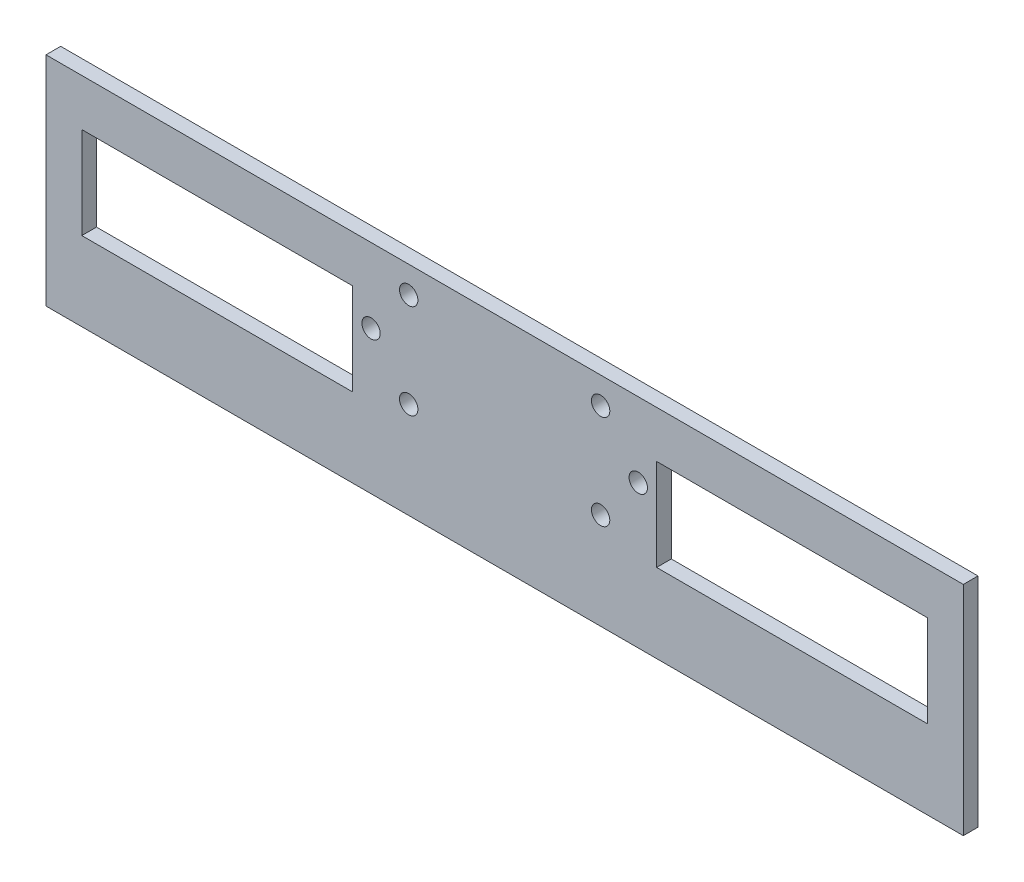
ISO-10303-21;
HEADER;
FILE_DESCRIPTION(('STEP AP214'),'2;1');
FILE_NAME('part.step','',(''),(''),'','','');
FILE_SCHEMA(('AUTOMOTIVE_DESIGN { 1 0 10303 214 1 1 1 1 }'));
ENDSEC;
DATA;
#1=APPLICATION_CONTEXT('core data for automotive mechanical design processes');
#2=APPLICATION_PROTOCOL_DEFINITION('international standard','automotive_design',2000,#1);
#3=PRODUCT_CONTEXT('',#1,'mechanical');
#4=PRODUCT('Part','Part','',(#3));
#5=PRODUCT_RELATED_PRODUCT_CATEGORY('part','',(#4));
#6=PRODUCT_DEFINITION_FORMATION('','',#4);
#7=PRODUCT_DEFINITION_CONTEXT('part definition',#1,'design');
#8=PRODUCT_DEFINITION('design','',#6,#7);
#9=PRODUCT_DEFINITION_SHAPE('','',#8);
#10=(LENGTH_UNIT() NAMED_UNIT(*) SI_UNIT(.MILLI.,.METRE.));
#11=(NAMED_UNIT(*) PLANE_ANGLE_UNIT() SI_UNIT($,.RADIAN.));
#12=(NAMED_UNIT(*) SI_UNIT($,.STERADIAN.) SOLID_ANGLE_UNIT());
#13=UNCERTAINTY_MEASURE_WITH_UNIT(LENGTH_MEASURE(1.E-05),#10,'distance_accuracy_value','');
#14=(GEOMETRIC_REPRESENTATION_CONTEXT(3) GLOBAL_UNCERTAINTY_ASSIGNED_CONTEXT((#13)) GLOBAL_UNIT_ASSIGNED_CONTEXT((#10,
#11,#12)) REPRESENTATION_CONTEXT('',''));
#15=CARTESIAN_POINT('',(0.,0.,0.));
#16=DIRECTION('',(0.,0.,1.));
#17=DIRECTION('',(1.,0.,0.));
#18=AXIS2_PLACEMENT_3D('',#15,#16,#17);
#19=CARTESIAN_POINT('',(0.,0.,1.6));
#20=DIRECTION('',(0.,0.,1.));
#21=DIRECTION('',(1.,0.,0.));
#22=AXIS2_PLACEMENT_3D('',#19,#20,#21);
#23=PLANE('',#22);
#24=CARTESIAN_POINT('',(64.5,-8.09999999999999,1.6));
#25=DIRECTION('',(0.,0.,1.));
#26=DIRECTION('',(-1.,0.,0.));
#27=AXIS2_PLACEMENT_3D('',#24,#25,#26);
#28=CIRCLE('',#27,0.999999999999998);
#29=CARTESIAN_POINT('',(63.5,-8.09999999999999,1.6));
#30=VERTEX_POINT('',#29);
#31=EDGE_CURVE('E315',#30,#30,#28,.T.);
#32=ORIENTED_EDGE('',*,*,#31,.F.);
#33=EDGE_LOOP('',(#32));
#34=FACE_BOUND('',#33,.T.);
#35=DIRECTION('',(-1.,0.,0.));
#36=VECTOR('',#35,1.);
#37=CARTESIAN_POINT('',(96.,-5.09999999999998,1.6));
#38=LINE('',#37,#36);
#39=CARTESIAN_POINT('',(96.,-5.09999999999998,1.6));
#40=VERTEX_POINT('',#39);
#41=CARTESIAN_POINT('',(66.5,-5.09999999999999,1.6));
#42=VERTEX_POINT('',#41);
#43=EDGE_CURVE('E133',#40,#42,#38,.T.);
#44=ORIENTED_EDGE('',*,*,#43,.F.);
#45=DIRECTION('',(0.,1.,0.));
#46=VECTOR('',#45,1.);
#47=CARTESIAN_POINT('',(96.,-5.09999999999998,1.6));
#48=LINE('',#47,#46);
#49=CARTESIAN_POINT('',(96.,-15.1,1.6));
#50=VERTEX_POINT('',#49);
#51=EDGE_CURVE('E125',#50,#40,#48,.T.);
#52=ORIENTED_EDGE('',*,*,#51,.F.);
#53=DIRECTION('',(1.,0.,0.));
#54=VECTOR('',#53,1.);
#55=CARTESIAN_POINT('',(96.,-15.1,1.6));
#56=LINE('',#55,#54);
#57=CARTESIAN_POINT('',(66.5,-15.1,1.6));
#58=VERTEX_POINT('',#57);
#59=EDGE_CURVE('E148',#58,#50,#56,.T.);
#60=ORIENTED_EDGE('',*,*,#59,.F.);
#61=DIRECTION('',(0.,-1.,0.));
#62=VECTOR('',#61,1.);
#63=CARTESIAN_POINT('',(66.5,-5.09999999999999,1.6));
#64=LINE('',#63,#62);
#65=EDGE_CURVE('E146',#42,#58,#64,.T.);
#66=ORIENTED_EDGE('',*,*,#65,.F.);
#67=EDGE_LOOP('',(#44,#52,#60,#66));
#68=FACE_BOUND('',#67,.T.);
#69=CARTESIAN_POINT('',(39.5,-13.2,1.6));
#70=DIRECTION('',(0.,0.,1.));
#71=DIRECTION('',(1.,0.,0.));
#72=AXIS2_PLACEMENT_3D('',#69,#70,#71);
#73=CIRCLE('',#72,0.999999999999998);
#74=CARTESIAN_POINT('',(40.5,-13.2,1.6));
#75=VERTEX_POINT('',#74);
#76=EDGE_CURVE('E164',#75,#75,#73,.T.);
#77=ORIENTED_EDGE('',*,*,#76,.F.);
#78=EDGE_LOOP('',(#77));
#79=FACE_BOUND('',#78,.T.);
#80=CARTESIAN_POINT('',(39.5,-2.9,1.6));
#81=DIRECTION('',(0.,0.,1.));
#82=DIRECTION('',(1.,0.,0.));
#83=AXIS2_PLACEMENT_3D('',#80,#81,#82);
#84=CIRCLE('',#83,0.999999999999998);
#85=CARTESIAN_POINT('',(40.5,-2.9,1.6));
#86=VERTEX_POINT('',#85);
#87=EDGE_CURVE('E176',#86,#86,#84,.T.);
#88=ORIENTED_EDGE('',*,*,#87,.F.);
#89=EDGE_LOOP('',(#88));
#90=FACE_BOUND('',#89,.T.);
#91=DIRECTION('',(0.,-1.,0.));
#92=VECTOR('',#91,1.);
#93=CARTESIAN_POINT('',(0.,0.,1.6));
#94=LINE('',#93,#92);
#95=CARTESIAN_POINT('',(0.,0.,1.6));
#96=VERTEX_POINT('',#95);
#97=CARTESIAN_POINT('',(0.,-23.7,1.6));
#98=VERTEX_POINT('',#97);
#99=EDGE_CURVE('E213',#96,#98,#94,.T.);
#100=ORIENTED_EDGE('',*,*,#99,.T.);
#101=DIRECTION('',(1.,0.,0.));
#102=VECTOR('',#101,1.);
#103=CARTESIAN_POINT('',(0.,-23.7,1.6));
#104=LINE('',#103,#102);
#105=CARTESIAN_POINT('',(99.9,-23.7,1.6));
#106=VERTEX_POINT('',#105);
#107=EDGE_CURVE('E216',#98,#106,#104,.T.);
#108=ORIENTED_EDGE('',*,*,#107,.T.);
#109=DIRECTION('',(0.,1.,0.));
#110=VECTOR('',#109,1.);
#111=CARTESIAN_POINT('',(99.9,0.,1.6));
#112=LINE('',#111,#110);
#113=CARTESIAN_POINT('',(99.9,0.,1.6));
#114=VERTEX_POINT('',#113);
#115=EDGE_CURVE('E219',#106,#114,#112,.T.);
#116=ORIENTED_EDGE('',*,*,#115,.T.);
#117=DIRECTION('',(-1.,0.,0.));
#118=VECTOR('',#117,1.);
#119=CARTESIAN_POINT('',(0.,0.,1.6));
#120=LINE('',#119,#118);
#121=EDGE_CURVE('E221',#114,#96,#120,.T.);
#122=ORIENTED_EDGE('',*,*,#121,.T.);
#123=EDGE_LOOP('',(#100,#108,#116,#122));
#124=FACE_BOUND('',#123,.T.);
#125=DIRECTION('',(1.,0.,0.));
#126=VECTOR('',#125,1.);
#127=CARTESIAN_POINT('',(3.9,-15.1,1.6));
#128=LINE('',#127,#126);
#129=CARTESIAN_POINT('',(3.9,-15.1,1.6));
#130=VERTEX_POINT('',#129);
#131=CARTESIAN_POINT('',(33.4,-15.1,1.6));
#132=VERTEX_POINT('',#131);
#133=EDGE_CURVE('E184',#130,#132,#128,.T.);
#134=ORIENTED_EDGE('',*,*,#133,.F.);
#135=DIRECTION('',(0.,-1.,0.));
#136=VECTOR('',#135,1.);
#137=CARTESIAN_POINT('',(3.9,-5.1,1.6));
#138=LINE('',#137,#136);
#139=CARTESIAN_POINT('',(3.9,-5.1,1.6));
#140=VERTEX_POINT('',#139);
#141=EDGE_CURVE('E182',#140,#130,#138,.T.);
#142=ORIENTED_EDGE('',*,*,#141,.F.);
#143=DIRECTION('',(-1.,0.,0.));
#144=VECTOR('',#143,1.);
#145=CARTESIAN_POINT('',(3.9,-5.1,1.6));
#146=LINE('',#145,#144);
#147=CARTESIAN_POINT('',(33.4,-5.1,1.6));
#148=VERTEX_POINT('',#147);
#149=EDGE_CURVE('E190',#148,#140,#146,.T.);
#150=ORIENTED_EDGE('',*,*,#149,.F.);
#151=DIRECTION('',(0.,1.,0.));
#152=VECTOR('',#151,1.);
#153=CARTESIAN_POINT('',(33.4,-5.1,1.6));
#154=LINE('',#153,#152);
#155=EDGE_CURVE('E187',#132,#148,#154,.T.);
#156=ORIENTED_EDGE('',*,*,#155,.F.);
#157=EDGE_LOOP('',(#134,#142,#150,#156));
#158=FACE_BOUND('',#157,.T.);
#159=CARTESIAN_POINT('',(35.4,-8.1,1.6));
#160=DIRECTION('',(0.,0.,1.));
#161=DIRECTION('',(1.,0.,0.));
#162=AXIS2_PLACEMENT_3D('',#159,#160,#161);
#163=CIRCLE('',#162,0.999999999999998);
#164=CARTESIAN_POINT('',(36.4,-8.1,1.6));
#165=VERTEX_POINT('',#164);
#166=EDGE_CURVE('E170',#165,#165,#163,.T.);
#167=ORIENTED_EDGE('',*,*,#166,.F.);
#168=EDGE_LOOP('',(#167));
#169=FACE_BOUND('',#168,.T.);
#170=CARTESIAN_POINT('',(60.4,-2.9,1.6));
#171=DIRECTION('',(0.,0.,1.));
#172=DIRECTION('',(-1.,0.,0.));
#173=AXIS2_PLACEMENT_3D('',#170,#171,#172);
#174=CIRCLE('',#173,0.999999999999998);
#175=CARTESIAN_POINT('',(59.4,-2.9,1.6));
#176=VERTEX_POINT('',#175);
#177=EDGE_CURVE('E154',#176,#176,#174,.T.);
#178=ORIENTED_EDGE('',*,*,#177,.F.);
#179=EDGE_LOOP('',(#178));
#180=FACE_BOUND('',#179,.T.);
#181=CARTESIAN_POINT('',(60.4,-13.2,1.6));
#182=DIRECTION('',(0.,0.,1.));
#183=DIRECTION('',(-1.,0.,0.));
#184=AXIS2_PLACEMENT_3D('',#181,#182,#183);
#185=CIRCLE('',#184,0.999999999999998);
#186=CARTESIAN_POINT('',(59.4,-13.2,1.6));
#187=VERTEX_POINT('',#186);
#188=EDGE_CURVE('E309',#187,#187,#185,.T.);
#189=ORIENTED_EDGE('',*,*,#188,.F.);
#190=EDGE_LOOP('',(#189));
#191=FACE_BOUND('',#190,.T.);
#192=ADVANCED_FACE('F36',(#34,#68,#79,#90,#124,#158,#169,#180,#191),#23,.T.);
#193=CARTESIAN_POINT('',(0.,0.,0.));
#194=DIRECTION('',(0.,0.,1.));
#195=DIRECTION('',(1.,0.,0.));
#196=AXIS2_PLACEMENT_3D('',#193,#194,#195);
#197=PLANE('',#196);
#198=CARTESIAN_POINT('',(39.5,-13.2,0.));
#199=DIRECTION('',(0.,0.,1.));
#200=DIRECTION('',(1.,0.,0.));
#201=AXIS2_PLACEMENT_3D('',#198,#199,#200);
#202=CIRCLE('',#201,0.999999999999998);
#203=CARTESIAN_POINT('',(40.5,-13.2,0.));
#204=VERTEX_POINT('',#203);
#205=EDGE_CURVE('E141',#204,#204,#202,.T.);
#206=ORIENTED_EDGE('',*,*,#205,.T.);
#207=EDGE_LOOP('',(#206));
#208=FACE_BOUND('',#207,.T.);
#209=CARTESIAN_POINT('',(35.4,-8.1,0.));
#210=DIRECTION('',(0.,0.,1.));
#211=DIRECTION('',(1.,0.,0.));
#212=AXIS2_PLACEMENT_3D('',#209,#210,#211);
#213=CIRCLE('',#212,0.999999999999998);
#214=CARTESIAN_POINT('',(36.4,-8.1,0.));
#215=VERTEX_POINT('',#214);
#216=EDGE_CURVE('E167',#215,#215,#213,.T.);
#217=ORIENTED_EDGE('',*,*,#216,.T.);
#218=EDGE_LOOP('',(#217));
#219=FACE_BOUND('',#218,.T.);
#220=CARTESIAN_POINT('',(39.5,-2.9,0.));
#221=DIRECTION('',(0.,0.,1.));
#222=DIRECTION('',(1.,0.,0.));
#223=AXIS2_PLACEMENT_3D('',#220,#221,#222);
#224=CIRCLE('',#223,0.999999999999998);
#225=CARTESIAN_POINT('',(40.5,-2.9,0.));
#226=VERTEX_POINT('',#225);
#227=EDGE_CURVE('E173',#226,#226,#224,.T.);
#228=ORIENTED_EDGE('',*,*,#227,.T.);
#229=EDGE_LOOP('',(#228));
#230=FACE_BOUND('',#229,.T.);
#231=DIRECTION('',(0.,-1.,0.));
#232=VECTOR('',#231,1.);
#233=CARTESIAN_POINT('',(3.9,-5.1,0.));
#234=LINE('',#233,#232);
#235=CARTESIAN_POINT('',(3.9,-5.1,0.));
#236=VERTEX_POINT('',#235);
#237=CARTESIAN_POINT('',(3.9,-15.1,0.));
#238=VERTEX_POINT('',#237);
#239=EDGE_CURVE('E179',#236,#238,#234,.T.);
#240=ORIENTED_EDGE('',*,*,#239,.T.);
#241=DIRECTION('',(1.,0.,0.));
#242=VECTOR('',#241,1.);
#243=CARTESIAN_POINT('',(3.9,-15.1,0.));
#244=LINE('',#243,#242);
#245=CARTESIAN_POINT('',(33.4,-15.1,0.));
#246=VERTEX_POINT('',#245);
#247=EDGE_CURVE('E195',#238,#246,#244,.T.);
#248=ORIENTED_EDGE('',*,*,#247,.T.);
#249=DIRECTION('',(0.,1.,0.));
#250=VECTOR('',#249,1.);
#251=CARTESIAN_POINT('',(33.4,-5.1,0.));
#252=LINE('',#251,#250);
#253=CARTESIAN_POINT('',(33.4,-5.1,0.));
#254=VERTEX_POINT('',#253);
#255=EDGE_CURVE('E198',#246,#254,#252,.T.);
#256=ORIENTED_EDGE('',*,*,#255,.T.);
#257=DIRECTION('',(-1.,0.,0.));
#258=VECTOR('',#257,1.);
#259=CARTESIAN_POINT('',(3.9,-5.1,0.));
#260=LINE('',#259,#258);
#261=EDGE_CURVE('E185',#254,#236,#260,.T.);
#262=ORIENTED_EDGE('',*,*,#261,.T.);
#263=EDGE_LOOP('',(#240,#248,#256,#262));
#264=FACE_BOUND('',#263,.T.);
#265=DIRECTION('',(0.,-1.,0.));
#266=VECTOR('',#265,1.);
#267=CARTESIAN_POINT('',(0.,0.,0.));
#268=LINE('',#267,#266);
#269=CARTESIAN_POINT('',(0.,0.,0.));
#270=VERTEX_POINT('',#269);
#271=CARTESIAN_POINT('',(0.,-23.7,0.));
#272=VERTEX_POINT('',#271);
#273=EDGE_CURVE('E212',#270,#272,#268,.T.);
#274=ORIENTED_EDGE('',*,*,#273,.F.);
#275=DIRECTION('',(-1.,0.,0.));
#276=VECTOR('',#275,1.);
#277=CARTESIAN_POINT('',(0.,0.,0.));
#278=LINE('',#277,#276);
#279=CARTESIAN_POINT('',(99.9,0.,0.));
#280=VERTEX_POINT('',#279);
#281=EDGE_CURVE('E217',#280,#270,#278,.T.);
#282=ORIENTED_EDGE('',*,*,#281,.F.);
#283=DIRECTION('',(0.,1.,0.));
#284=VECTOR('',#283,1.);
#285=CARTESIAN_POINT('',(99.9,0.,0.));
#286=LINE('',#285,#284);
#287=CARTESIAN_POINT('',(99.9,-23.7,0.));
#288=VERTEX_POINT('',#287);
#289=EDGE_CURVE('E228',#288,#280,#286,.T.);
#290=ORIENTED_EDGE('',*,*,#289,.F.);
#291=DIRECTION('',(1.,0.,0.));
#292=VECTOR('',#291,1.);
#293=CARTESIAN_POINT('',(0.,-23.7,0.));
#294=LINE('',#293,#292);
#295=EDGE_CURVE('E226',#272,#288,#294,.T.);
#296=ORIENTED_EDGE('',*,*,#295,.F.);
#297=EDGE_LOOP('',(#274,#282,#290,#296));
#298=FACE_BOUND('',#297,.T.);
#299=DIRECTION('',(0.,1.,0.));
#300=VECTOR('',#299,1.);
#301=CARTESIAN_POINT('',(96.,-5.09999999999998,0.));
#302=LINE('',#301,#300);
#303=CARTESIAN_POINT('',(96.,-15.1,0.));
#304=VERTEX_POINT('',#303);
#305=CARTESIAN_POINT('',(96.,-5.09999999999998,0.));
#306=VERTEX_POINT('',#305);
#307=EDGE_CURVE('E59',#304,#306,#302,.T.);
#308=ORIENTED_EDGE('',*,*,#307,.T.);
#309=DIRECTION('',(-1.,0.,0.));
#310=VECTOR('',#309,1.);
#311=CARTESIAN_POINT('',(96.,-5.09999999999998,0.));
#312=LINE('',#311,#310);
#313=CARTESIAN_POINT('',(66.5,-5.09999999999999,0.));
#314=VERTEX_POINT('',#313);
#315=EDGE_CURVE('E140',#306,#314,#312,.T.);
#316=ORIENTED_EDGE('',*,*,#315,.T.);
#317=DIRECTION('',(0.,-1.,0.));
#318=VECTOR('',#317,1.);
#319=CARTESIAN_POINT('',(66.5,-5.09999999999999,0.));
#320=LINE('',#319,#318);
#321=CARTESIAN_POINT('',(66.5,-15.1,0.));
#322=VERTEX_POINT('',#321);
#323=EDGE_CURVE('E156',#314,#322,#320,.T.);
#324=ORIENTED_EDGE('',*,*,#323,.T.);
#325=DIRECTION('',(1.,0.,0.));
#326=VECTOR('',#325,1.);
#327=CARTESIAN_POINT('',(96.,-15.1,0.));
#328=LINE('',#327,#326);
#329=EDGE_CURVE('E134',#322,#304,#328,.T.);
#330=ORIENTED_EDGE('',*,*,#329,.T.);
#331=EDGE_LOOP('',(#308,#316,#324,#330));
#332=FACE_BOUND('',#331,.T.);
#333=CARTESIAN_POINT('',(60.4,-2.9,0.));
#334=DIRECTION('',(0.,0.,1.));
#335=DIRECTION('',(-1.,0.,0.));
#336=AXIS2_PLACEMENT_3D('',#333,#334,#335);
#337=CIRCLE('',#336,0.999999999999998);
#338=CARTESIAN_POINT('',(59.4,-2.9,0.));
#339=VERTEX_POINT('',#338);
#340=EDGE_CURVE('E321',#339,#339,#337,.T.);
#341=ORIENTED_EDGE('',*,*,#340,.T.);
#342=EDGE_LOOP('',(#341));
#343=FACE_BOUND('',#342,.T.);
#344=CARTESIAN_POINT('',(64.5,-8.09999999999999,0.));
#345=DIRECTION('',(0.,0.,1.));
#346=DIRECTION('',(-1.,0.,0.));
#347=AXIS2_PLACEMENT_3D('',#344,#345,#346);
#348=CIRCLE('',#347,0.999999999999998);
#349=CARTESIAN_POINT('',(63.5,-8.09999999999999,0.));
#350=VERTEX_POINT('',#349);
#351=EDGE_CURVE('E311',#350,#350,#348,.T.);
#352=ORIENTED_EDGE('',*,*,#351,.T.);
#353=EDGE_LOOP('',(#352));
#354=FACE_BOUND('',#353,.T.);
#355=CARTESIAN_POINT('',(60.4,-13.2,0.));
#356=DIRECTION('',(0.,0.,1.));
#357=DIRECTION('',(-1.,0.,0.));
#358=AXIS2_PLACEMENT_3D('',#355,#356,#357);
#359=CIRCLE('',#358,0.999999999999998);
#360=CARTESIAN_POINT('',(59.4,-13.2,0.));
#361=VERTEX_POINT('',#360);
#362=EDGE_CURVE('E312',#361,#361,#359,.T.);
#363=ORIENTED_EDGE('',*,*,#362,.T.);
#364=EDGE_LOOP('',(#363));
#365=FACE_BOUND('',#364,.T.);
#366=ADVANCED_FACE('F246',(#208,#219,#230,#264,#298,#332,#343,#354,#365),#197,.F.);
#367=CARTESIAN_POINT('',(0.,0.,1.6));
#368=DIRECTION('',(1.,0.,0.));
#369=DIRECTION('',(0.,1.,0.));
#370=AXIS2_PLACEMENT_3D('',#367,#368,#369);
#371=PLANE('',#370);
#372=ORIENTED_EDGE('',*,*,#273,.T.);
#373=DIRECTION('',(0.,0.,-1.));
#374=VECTOR('',#373,1.);
#375=CARTESIAN_POINT('',(0.,-23.7,1.6));
#376=LINE('',#375,#374);
#377=EDGE_CURVE('E11',#98,#272,#376,.T.);
#378=ORIENTED_EDGE('',*,*,#377,.F.);
#379=ORIENTED_EDGE('',*,*,#99,.F.);
#380=DIRECTION('',(0.,0.,-1.));
#381=VECTOR('',#380,1.);
#382=CARTESIAN_POINT('',(0.,0.,1.6));
#383=LINE('',#382,#381);
#384=EDGE_CURVE('E223',#96,#270,#383,.T.);
#385=ORIENTED_EDGE('',*,*,#384,.T.);
#386=EDGE_LOOP('',(#372,#378,#379,#385));
#387=FACE_BOUND('',#386,.T.);
#388=ADVANCED_FACE('F38',(#387),#371,.F.);
#389=CARTESIAN_POINT('',(0.,-23.7,1.6));
#390=DIRECTION('',(0.,1.,0.));
#391=DIRECTION('',(0.,0.,1.));
#392=AXIS2_PLACEMENT_3D('',#389,#390,#391);
#393=PLANE('',#392);
#394=ORIENTED_EDGE('',*,*,#295,.T.);
#395=DIRECTION('',(0.,0.,-1.));
#396=VECTOR('',#395,1.);
#397=CARTESIAN_POINT('',(99.9,-23.7,1.6));
#398=LINE('',#397,#396);
#399=EDGE_CURVE('E44',#106,#288,#398,.T.);
#400=ORIENTED_EDGE('',*,*,#399,.F.);
#401=ORIENTED_EDGE('',*,*,#107,.F.);
#402=ORIENTED_EDGE('',*,*,#377,.T.);
#403=EDGE_LOOP('',(#394,#400,#401,#402));
#404=FACE_BOUND('',#403,.T.);
#405=ADVANCED_FACE('F257',(#404),#393,.F.);
#406=CARTESIAN_POINT('',(99.9,0.,1.6));
#407=DIRECTION('',(-1.,0.,0.));
#408=DIRECTION('',(0.,0.,1.));
#409=AXIS2_PLACEMENT_3D('',#406,#407,#408);
#410=PLANE('',#409);
#411=ORIENTED_EDGE('',*,*,#289,.T.);
#412=DIRECTION('',(0.,0.,-1.));
#413=VECTOR('',#412,1.);
#414=CARTESIAN_POINT('',(99.9,0.,1.6));
#415=LINE('',#414,#413);
#416=EDGE_CURVE('E233',#114,#280,#415,.T.);
#417=ORIENTED_EDGE('',*,*,#416,.F.);
#418=ORIENTED_EDGE('',*,*,#115,.F.);
#419=ORIENTED_EDGE('',*,*,#399,.T.);
#420=EDGE_LOOP('',(#411,#417,#418,#419));
#421=FACE_BOUND('',#420,.T.);
#422=ADVANCED_FACE('F240',(#421),#410,.F.);
#423=CARTESIAN_POINT('',(0.,0.,1.6));
#424=DIRECTION('',(0.,-1.,0.));
#425=DIRECTION('',(0.,0.,-1.));
#426=AXIS2_PLACEMENT_3D('',#423,#424,#425);
#427=PLANE('',#426);
#428=ORIENTED_EDGE('',*,*,#281,.T.);
#429=ORIENTED_EDGE('',*,*,#384,.F.);
#430=ORIENTED_EDGE('',*,*,#121,.F.);
#431=ORIENTED_EDGE('',*,*,#416,.T.);
#432=EDGE_LOOP('',(#428,#429,#430,#431));
#433=FACE_BOUND('',#432,.T.);
#434=ADVANCED_FACE('F250',(#433),#427,.F.);
#435=CARTESIAN_POINT('',(3.9,-5.1,1.6));
#436=DIRECTION('',(1.,0.,0.));
#437=DIRECTION('',(0.,1.,0.));
#438=AXIS2_PLACEMENT_3D('',#435,#436,#437);
#439=PLANE('',#438);
#440=ORIENTED_EDGE('',*,*,#239,.F.);
#441=DIRECTION('',(0.,0.,-1.));
#442=VECTOR('',#441,1.);
#443=CARTESIAN_POINT('',(3.9,-5.1,1.6));
#444=LINE('',#443,#442);
#445=EDGE_CURVE('E192',#140,#236,#444,.T.);
#446=ORIENTED_EDGE('',*,*,#445,.F.);
#447=ORIENTED_EDGE('',*,*,#141,.T.);
#448=DIRECTION('',(0.,0.,-1.));
#449=VECTOR('',#448,1.);
#450=CARTESIAN_POINT('',(3.9,-15.1,1.6));
#451=LINE('',#450,#449);
#452=EDGE_CURVE('E209',#130,#238,#451,.T.);
#453=ORIENTED_EDGE('',*,*,#452,.T.);
#454=EDGE_LOOP('',(#440,#446,#447,#453));
#455=FACE_BOUND('',#454,.T.);
#456=ADVANCED_FACE('F274',(#455),#439,.T.);
#457=CARTESIAN_POINT('',(3.9,-15.1,1.6));
#458=DIRECTION('',(0.,1.,0.));
#459=DIRECTION('',(0.,0.,1.));
#460=AXIS2_PLACEMENT_3D('',#457,#458,#459);
#461=PLANE('',#460);
#462=ORIENTED_EDGE('',*,*,#247,.F.);
#463=ORIENTED_EDGE('',*,*,#452,.F.);
#464=ORIENTED_EDGE('',*,*,#133,.T.);
#465=DIRECTION('',(0.,0.,-1.));
#466=VECTOR('',#465,1.);
#467=CARTESIAN_POINT('',(33.4,-15.1,1.6));
#468=LINE('',#467,#466);
#469=EDGE_CURVE('E207',#132,#246,#468,.T.);
#470=ORIENTED_EDGE('',*,*,#469,.T.);
#471=EDGE_LOOP('',(#462,#463,#464,#470));
#472=FACE_BOUND('',#471,.T.);
#473=ADVANCED_FACE('F281',(#472),#461,.T.);
#474=CARTESIAN_POINT('',(33.4,-5.1,1.6));
#475=DIRECTION('',(-1.,0.,0.));
#476=DIRECTION('',(0.,0.,1.));
#477=AXIS2_PLACEMENT_3D('',#474,#475,#476);
#478=PLANE('',#477);
#479=ORIENTED_EDGE('',*,*,#255,.F.);
#480=ORIENTED_EDGE('',*,*,#469,.F.);
#481=ORIENTED_EDGE('',*,*,#155,.T.);
#482=DIRECTION('',(0.,0.,-1.));
#483=VECTOR('',#482,1.);
#484=CARTESIAN_POINT('',(33.4,-5.1,1.6));
#485=LINE('',#484,#483);
#486=EDGE_CURVE('E205',#148,#254,#485,.T.);
#487=ORIENTED_EDGE('',*,*,#486,.T.);
#488=EDGE_LOOP('',(#479,#480,#481,#487));
#489=FACE_BOUND('',#488,.T.);
#490=ADVANCED_FACE('F286',(#489),#478,.T.);
#491=CARTESIAN_POINT('',(3.9,-5.1,1.6));
#492=DIRECTION('',(0.,-1.,0.));
#493=DIRECTION('',(0.,0.,-1.));
#494=AXIS2_PLACEMENT_3D('',#491,#492,#493);
#495=PLANE('',#494);
#496=ORIENTED_EDGE('',*,*,#261,.F.);
#497=ORIENTED_EDGE('',*,*,#486,.F.);
#498=ORIENTED_EDGE('',*,*,#149,.T.);
#499=ORIENTED_EDGE('',*,*,#445,.T.);
#500=EDGE_LOOP('',(#496,#497,#498,#499));
#501=FACE_BOUND('',#500,.T.);
#502=ADVANCED_FACE('F294',(#501),#495,.T.);
#503=CARTESIAN_POINT('',(39.5,-2.9,1.6));
#504=DIRECTION('',(0.,0.,-1.));
#505=DIRECTION('',(-1.,0.,0.));
#506=AXIS2_PLACEMENT_3D('',#503,#504,#505);
#507=CYLINDRICAL_SURFACE('',#506,0.999999999999998);
#508=ORIENTED_EDGE('',*,*,#87,.T.);
#509=EDGE_LOOP('',(#508));
#510=FACE_BOUND('',#509,.T.);
#511=ORIENTED_EDGE('',*,*,#227,.F.);
#512=EDGE_LOOP('',(#511));
#513=FACE_BOUND('',#512,.T.);
#514=ADVANCED_FACE('F359',(#510,#513),#507,.F.);
#515=CARTESIAN_POINT('',(35.4,-8.1,1.6));
#516=DIRECTION('',(0.,0.,-1.));
#517=DIRECTION('',(-1.,0.,0.));
#518=AXIS2_PLACEMENT_3D('',#515,#516,#517);
#519=CYLINDRICAL_SURFACE('',#518,0.999999999999998);
#520=ORIENTED_EDGE('',*,*,#166,.T.);
#521=EDGE_LOOP('',(#520));
#522=FACE_BOUND('',#521,.T.);
#523=ORIENTED_EDGE('',*,*,#216,.F.);
#524=EDGE_LOOP('',(#523));
#525=FACE_BOUND('',#524,.T.);
#526=ADVANCED_FACE('F355',(#522,#525),#519,.F.);
#527=CARTESIAN_POINT('',(39.5,-13.2,1.6));
#528=DIRECTION('',(0.,0.,-1.));
#529=DIRECTION('',(-1.,0.,0.));
#530=AXIS2_PLACEMENT_3D('',#527,#528,#529);
#531=CYLINDRICAL_SURFACE('',#530,0.999999999999998);
#532=ORIENTED_EDGE('',*,*,#76,.T.);
#533=EDGE_LOOP('',(#532));
#534=FACE_BOUND('',#533,.T.);
#535=ORIENTED_EDGE('',*,*,#205,.F.);
#536=EDGE_LOOP('',(#535));
#537=FACE_BOUND('',#536,.T.);
#538=ADVANCED_FACE('F352',(#534,#537),#531,.F.);
#539=CARTESIAN_POINT('',(96.,-5.09999999999998,1.6));
#540=DIRECTION('',(-1.,0.,0.));
#541=DIRECTION('',(0.,0.,1.));
#542=AXIS2_PLACEMENT_3D('',#539,#540,#541);
#543=PLANE('',#542);
#544=ORIENTED_EDGE('',*,*,#307,.F.);
#545=DIRECTION('',(0.,0.,-1.));
#546=VECTOR('',#545,1.);
#547=CARTESIAN_POINT('',(96.,-15.1,1.6));
#548=LINE('',#547,#546);
#549=EDGE_CURVE('E129',#50,#304,#548,.T.);
#550=ORIENTED_EDGE('',*,*,#549,.F.);
#551=ORIENTED_EDGE('',*,*,#51,.T.);
#552=DIRECTION('',(0.,0.,-1.));
#553=VECTOR('',#552,1.);
#554=CARTESIAN_POINT('',(96.,-5.09999999999998,1.6));
#555=LINE('',#554,#553);
#556=EDGE_CURVE('E128',#40,#306,#555,.T.);
#557=ORIENTED_EDGE('',*,*,#556,.T.);
#558=EDGE_LOOP('',(#544,#550,#551,#557));
#559=FACE_BOUND('',#558,.T.);
#560=ADVANCED_FACE('F127',(#559),#543,.T.);
#561=CARTESIAN_POINT('',(96.,-5.09999999999998,1.6));
#562=DIRECTION('',(0.,-1.,0.));
#563=DIRECTION('',(1.,0.,0.));
#564=AXIS2_PLACEMENT_3D('',#561,#562,#563);
#565=PLANE('',#564);
#566=ORIENTED_EDGE('',*,*,#315,.F.);
#567=ORIENTED_EDGE('',*,*,#556,.F.);
#568=ORIENTED_EDGE('',*,*,#43,.T.);
#569=DIRECTION('',(0.,0.,-1.));
#570=VECTOR('',#569,1.);
#571=CARTESIAN_POINT('',(66.5,-5.09999999999999,1.6));
#572=LINE('',#571,#570);
#573=EDGE_CURVE('E142',#42,#314,#572,.T.);
#574=ORIENTED_EDGE('',*,*,#573,.T.);
#575=EDGE_LOOP('',(#566,#567,#568,#574));
#576=FACE_BOUND('',#575,.T.);
#577=ADVANCED_FACE('F137',(#576),#565,.T.);
#578=CARTESIAN_POINT('',(66.5,-5.09999999999999,1.6));
#579=DIRECTION('',(1.,0.,0.));
#580=DIRECTION('',(0.,0.,-1.));
#581=AXIS2_PLACEMENT_3D('',#578,#579,#580);
#582=PLANE('',#581);
#583=ORIENTED_EDGE('',*,*,#323,.F.);
#584=ORIENTED_EDGE('',*,*,#573,.F.);
#585=ORIENTED_EDGE('',*,*,#65,.T.);
#586=DIRECTION('',(0.,0.,-1.));
#587=VECTOR('',#586,1.);
#588=CARTESIAN_POINT('',(66.5,-15.1,1.6));
#589=LINE('',#588,#587);
#590=EDGE_CURVE('E51',#58,#322,#589,.T.);
#591=ORIENTED_EDGE('',*,*,#590,.T.);
#592=EDGE_LOOP('',(#583,#584,#585,#591));
#593=FACE_BOUND('',#592,.T.);
#594=ADVANCED_FACE('F341',(#593),#582,.T.);
#595=CARTESIAN_POINT('',(96.,-15.1,1.6));
#596=DIRECTION('',(0.,1.,0.));
#597=DIRECTION('',(-1.,0.,0.));
#598=AXIS2_PLACEMENT_3D('',#595,#596,#597);
#599=PLANE('',#598);
#600=ORIENTED_EDGE('',*,*,#329,.F.);
#601=ORIENTED_EDGE('',*,*,#590,.F.);
#602=ORIENTED_EDGE('',*,*,#59,.T.);
#603=ORIENTED_EDGE('',*,*,#549,.T.);
#604=EDGE_LOOP('',(#600,#601,#602,#603));
#605=FACE_BOUND('',#604,.T.);
#606=ADVANCED_FACE('F331',(#605),#599,.T.);
#607=CARTESIAN_POINT('',(60.4,-2.9,1.6));
#608=DIRECTION('',(0.,0.,-1.));
#609=DIRECTION('',(-1.,0.,0.));
#610=AXIS2_PLACEMENT_3D('',#607,#608,#609);
#611=CYLINDRICAL_SURFACE('',#610,0.999999999999998);
#612=ORIENTED_EDGE('',*,*,#177,.T.);
#613=EDGE_LOOP('',(#612));
#614=FACE_BOUND('',#613,.T.);
#615=ORIENTED_EDGE('',*,*,#340,.F.);
#616=EDGE_LOOP('',(#615));
#617=FACE_BOUND('',#616,.T.);
#618=ADVANCED_FACE('F328',(#614,#617),#611,.F.);
#619=CARTESIAN_POINT('',(64.5,-8.09999999999999,1.6));
#620=DIRECTION('',(0.,0.,-1.));
#621=DIRECTION('',(-1.,0.,0.));
#622=AXIS2_PLACEMENT_3D('',#619,#620,#621);
#623=CYLINDRICAL_SURFACE('',#622,0.999999999999998);
#624=ORIENTED_EDGE('',*,*,#31,.T.);
#625=EDGE_LOOP('',(#624));
#626=FACE_BOUND('',#625,.T.);
#627=ORIENTED_EDGE('',*,*,#351,.F.);
#628=EDGE_LOOP('',(#627));
#629=FACE_BOUND('',#628,.T.);
#630=ADVANCED_FACE('F330',(#626,#629),#623,.F.);
#631=CARTESIAN_POINT('',(60.4,-13.2,1.6));
#632=DIRECTION('',(0.,0.,-1.));
#633=DIRECTION('',(-1.,0.,0.));
#634=AXIS2_PLACEMENT_3D('',#631,#632,#633);
#635=CYLINDRICAL_SURFACE('',#634,0.999999999999998);
#636=ORIENTED_EDGE('',*,*,#188,.T.);
#637=EDGE_LOOP('',(#636));
#638=FACE_BOUND('',#637,.T.);
#639=ORIENTED_EDGE('',*,*,#362,.F.);
#640=EDGE_LOOP('',(#639));
#641=FACE_BOUND('',#640,.T.);
#642=ADVANCED_FACE('F338',(#638,#641),#635,.F.);
#643=CLOSED_SHELL('',(#192,#366,#388,#405,#422,#434,#456,#473,#490,#502,#514,#526,#538,#560,
#577,#594,#606,#618,#630,#642));
#644=MANIFOLD_SOLID_BREP('B2',#643);
#645=ADVANCED_BREP_SHAPE_REPRESENTATION('',(#18,#644),#14);
#646=SHAPE_DEFINITION_REPRESENTATION(#9,#645);
ENDSEC;
END-ISO-10303-21;
